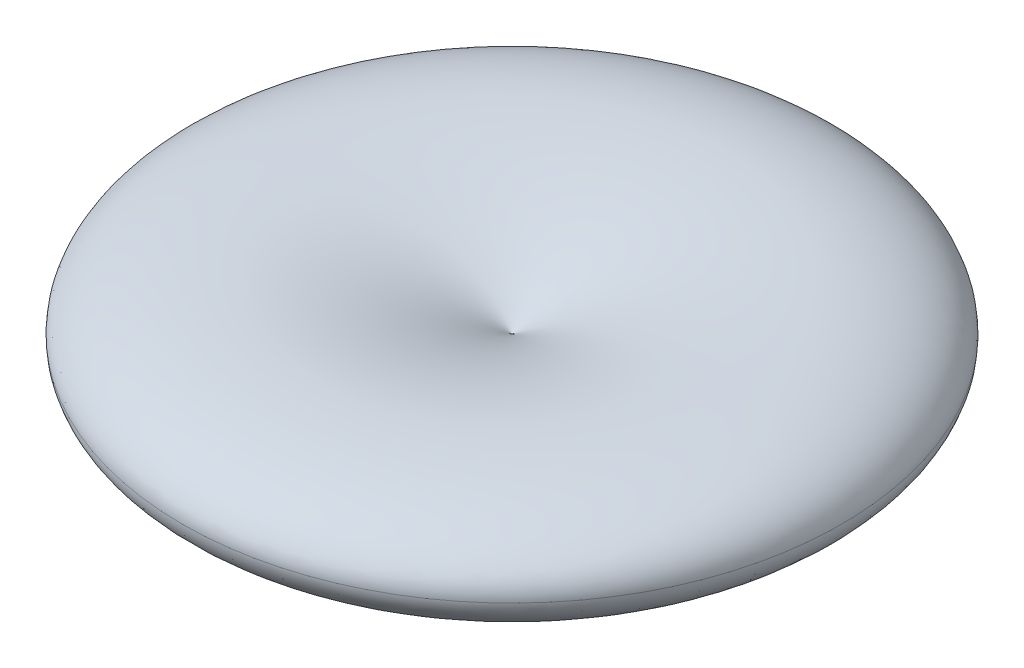
ISO-10303-21;
HEADER;
FILE_DESCRIPTION(('STEP AP214'),'2;1');
FILE_NAME('part.step','',(''),(''),'','','');
FILE_SCHEMA(('AUTOMOTIVE_DESIGN { 1 0 10303 214 1 1 1 1 }'));
ENDSEC;
DATA;
#1=APPLICATION_CONTEXT('core data for automotive mechanical design processes');
#2=APPLICATION_PROTOCOL_DEFINITION('international standard','automotive_design',2000,#1);
#3=PRODUCT_CONTEXT('',#1,'mechanical');
#4=PRODUCT('Part','Part','',(#3));
#5=PRODUCT_RELATED_PRODUCT_CATEGORY('part','',(#4));
#6=PRODUCT_DEFINITION_FORMATION('','',#4);
#7=PRODUCT_DEFINITION_CONTEXT('part definition',#1,'design');
#8=PRODUCT_DEFINITION('design','',#6,#7);
#9=PRODUCT_DEFINITION_SHAPE('','',#8);
#10=(LENGTH_UNIT() NAMED_UNIT(*) SI_UNIT(.MILLI.,.METRE.));
#11=(NAMED_UNIT(*) PLANE_ANGLE_UNIT() SI_UNIT($,.RADIAN.));
#12=(NAMED_UNIT(*) SI_UNIT($,.STERADIAN.) SOLID_ANGLE_UNIT());
#13=UNCERTAINTY_MEASURE_WITH_UNIT(LENGTH_MEASURE(1.E-05),#10,'distance_accuracy_value','');
#14=(GEOMETRIC_REPRESENTATION_CONTEXT(3) GLOBAL_UNCERTAINTY_ASSIGNED_CONTEXT((#13)) GLOBAL_UNIT_ASSIGNED_CONTEXT((#10,
#11,#12)) REPRESENTATION_CONTEXT('',''));
#15=CARTESIAN_POINT('',(0.,0.,0.));
#16=DIRECTION('',(0.,0.,1.));
#17=DIRECTION('',(1.,0.,0.));
#18=AXIS2_PLACEMENT_3D('',#15,#16,#17);
#19=CARTESIAN_POINT('',(99.4718394324346,-1.41039620800381E-10,0.));
#20=CARTESIAN_POINT('',(99.4718394324349,0.0144473478598722,0.));
#21=CARTESIAN_POINT('',(99.4715963263683,0.100376853939794,0.));
#22=CARTESIAN_POINT('',(99.4685044150183,0.260668693889387,0.));
#23=CARTESIAN_POINT('',(99.4533601096298,0.595682837165313,0.));
#24=CARTESIAN_POINT('',(99.41462537763,0.976418463843451,0.));
#25=CARTESIAN_POINT('',(99.3540461523916,1.36792825547944,0.));
#26=CARTESIAN_POINT('',(99.2534705677326,1.84681254939985,0.));
#27=CARTESIAN_POINT('',(99.1193903452542,2.34541049901015,0.));
#28=CARTESIAN_POINT('',(98.9206476731979,2.92374474966602,0.));
#29=CARTESIAN_POINT('',(98.6666319674632,3.50881884179896,0.));
#30=CARTESIAN_POINT('',(98.4016990429706,4.02461099086367,0.));
#31=CARTESIAN_POINT('',(98.0888839282801,4.56282402655693,0.));
#32=CARTESIAN_POINT('',(97.6951640008285,5.16212026891656,0.));
#33=CARTESIAN_POINT('',(97.1628176963727,5.86245289417468,0.));
#34=CARTESIAN_POINT('',(96.4373625251156,6.67731268259527,0.));
#35=CARTESIAN_POINT('',(95.5801255515856,7.50406015068173,0.));
#36=CARTESIAN_POINT('',(94.1898605246025,8.66771778819424,0.));
#37=CARTESIAN_POINT('',(92.1718544682701,10.0353728990684,0.));
#38=CARTESIAN_POINT('',(88.7774555219353,11.8371311972641,0.));
#39=CARTESIAN_POINT('',(83.7941691182405,13.6885492795961,0.));
#40=CARTESIAN_POINT('',(77.7625857397567,15.160935199828,0.));
#41=CARTESIAN_POINT('',(70.7294384458321,16.1308030471506,0.));
#42=CARTESIAN_POINT('',(63.5783466010685,16.5211973437359,0.));
#43=CARTESIAN_POINT('',(56.4188321795734,16.4110938369487,0.));
#44=CARTESIAN_POINT('',(49.2809304503626,15.8582302343043,0.));
#45=CARTESIAN_POINT('',(42.1864106461984,14.9008277002336,0.));
#46=CARTESIAN_POINT('',(35.1538909111103,13.5637629870977,0.));
#47=CARTESIAN_POINT('',(28.2009080374972,11.8610539754108,0.));
#48=CARTESIAN_POINT('',(21.346440136669,9.79684335553188,0.));
#49=CARTESIAN_POINT('',(15.4553760410452,7.66755148933256,0.));
#50=CARTESIAN_POINT('',(10.5026449447544,5.59592664226658,0.));
#51=CARTESIAN_POINT('',(6.62849030662822,3.7653929022448,0.));
#52=CARTESIAN_POINT('',(4.09896762801983,2.45476644253162,0.));
#53=CARTESIAN_POINT('',(2.24288406164808,1.40809591677828,0.));
#54=CARTESIAN_POINT('',(1.03451712583629,0.676317583030087,0.));
#55=CARTESIAN_POINT('',(0.438854819676063,0.296647328042432,0.));
#56=CARTESIAN_POINT('',(0.145358986213732,0.100261936553596,0.));
#57=CARTESIAN_POINT('',(0.,0.,0.));
#58=B_SPLINE_CURVE_WITH_KNOTS('',4,(#19,#20,#21,#22,#23,#24,#25,#26,#27,#28,#29,#30,#31,#32,#33,
#34,#35,#36,#37,#38,#39,#40,#41,#42,#43,#44,#45,#46,#47,#48,#49,#50,#51,#52,#53,#54,#55,#56,
#57),.UNSPECIFIED.,.F.,.F.,(5,1,1,1,1,1,1,1,1,1,1,1,1,1,1,1,1,1,1,1,1,1,1,1,1,1,1,1,1,1,1,1,1,1,
1,5),(0.,0.000530210460833125,0.00315120347170672,0.00577219648258021,0.0110141825043273,
0.0139325419690106,0.0168509014336941,0.0226876203630608,0.0288778054913386,0.0350679906196163,
0.0389048242343006,0.042741657848985,0.0504153250783538,0.0598661429218292,0.0693169607653048,
0.0804571481485323,0.09159733553176,0.122549245223811,0.15350103347294,0.213139912019091,
0.275043636222489,0.336947586705361,0.398851491376333,0.460755318045574,0.522659212220314,
0.584563072117397,0.646466896094265,0.708370874833197,0.770274852626706,0.83217861305455,
0.863130557962588,0.894082502870626,0.918524370822753,0.930745304798817,0.936855771786849,
0.942966238774881),.UNSPECIFIED.);
#59=CARTESIAN_POINT('',(-0.00647699333017381,-1000.04959738152,0.));
#60=DIRECTION('',(0.,-1.,0.));
#61=AXIS1_PLACEMENT('',#59,#60);
#62=SURFACE_OF_REVOLUTION('',#58,#61);
#63=CARTESIAN_POINT('',(-0.00647699333017381,0.,0.));
#64=DIRECTION('',(0.,-1.,0.));
#65=DIRECTION('',(0.,0.,-1.));
#66=AXIS2_PLACEMENT_3D('',#63,#64,#65);
#67=CIRCLE('',#66,0.00647699333017381);
#68=CARTESIAN_POINT('',(-0.00647699333017381,0.,-0.00647699333017381));
#69=VERTEX_POINT('',#68);
#70=EDGE_CURVE('E10',#69,#69,#67,.T.);
#71=ORIENTED_EDGE('',*,*,#70,.T.);
#72=EDGE_LOOP('',(#71));
#73=FACE_BOUND('',#72,.T.);
#74=CARTESIAN_POINT('',(-0.00647699333017381,-1.99840144432528E-12,0.));
#75=DIRECTION('',(0.,-1.,0.));
#76=DIRECTION('',(0.,0.,-1.));
#77=AXIS2_PLACEMENT_3D('',#74,#75,#76);
#78=CIRCLE('',#77,99.4783164257647);
#79=CARTESIAN_POINT('',(-0.00647699333017381,-1.99840144432528E-12,-99.4783164257647));
#80=VERTEX_POINT('',#79);
#81=EDGE_CURVE('E49',#80,#80,#78,.T.);
#82=ORIENTED_EDGE('',*,*,#81,.F.);
#83=EDGE_LOOP('',(#82));
#84=FACE_BOUND('',#83,.T.);
#85=ADVANCED_FACE('F41',(#73,#84),#62,.F.);
#86=CARTESIAN_POINT('',(0.,0.,0.));
#87=CARTESIAN_POINT('',(0.145790193622739,-0.100692877462947,0.));
#88=CARTESIAN_POINT('',(0.440407379928867,-0.297572779508345,0.));
#89=CARTESIAN_POINT('',(1.03805586437076,-0.678588563776049,0.));
#90=CARTESIAN_POINT('',(2.25066357804879,-1.41265533661017,0.));
#91=CARTESIAN_POINT('',(4.11259306865996,-2.46221760241834,0.));
#92=CARTESIAN_POINT('',(6.64973718207151,-3.77601640337769,0.));
#93=CARTESIAN_POINT('',(10.5349426129518,-5.61039561330158,0.));
#94=CARTESIAN_POINT('',(15.5012055007063,-7.68558056846305,0.));
#95=CARTESIAN_POINT('',(21.4084209799942,-9.81774728798721,0.));
#96=CARTESIAN_POINT('',(28.281738353775,-11.8834826549286,0.));
#97=CARTESIAN_POINT('',(35.2538280249267,-13.585869012048,0.));
#98=CARTESIAN_POINT('',(42.3056239703544,-14.920600217194,0.));
#99=CARTESIAN_POINT('',(49.4194217917738,-15.8733792349676,0.));
#100=CARTESIAN_POINT('',(56.5764762379778,-16.418944424255,0.));
#101=CARTESIAN_POINT('',(63.7546399679416,-16.5184104428506,0.));
#102=CARTESIAN_POINT('',(70.9235749423757,-16.1131035353008,0.));
#103=CARTESIAN_POINT('',(77.9370723723476,-15.1273829323976,0.));
#104=CARTESIAN_POINT('',(83.9454366027072,-13.6418615029591,0.));
#105=CARTESIAN_POINT('',(88.4804835597658,-11.9390769856124,0.));
#106=CARTESIAN_POINT('',(91.5857939123231,-10.3444370524486,0.));
#107=CARTESIAN_POINT('',(93.3773120308152,-9.21910907250545,0.));
#108=CARTESIAN_POINT('',(94.6211634499267,-8.31228349452792,0.));
#109=CARTESIAN_POINT('',(95.658146182042,-7.43334181135984,0.));
#110=CARTESIAN_POINT('',(96.5023724026683,-6.60916461083643,0.));
#111=CARTESIAN_POINT('',(97.2160582091683,-5.79701297751152,0.));
#112=CARTESIAN_POINT('',(97.8058956345197,-5.0110922904425,0.));
#113=CARTESIAN_POINT('',(98.281855630458,-4.25547197867446,0.));
#114=CARTESIAN_POINT('',(98.6547440507108,-3.54355480916215,0.));
#115=CARTESIAN_POINT('',(98.9478686536208,-2.8532090963375,0.));
#116=CARTESIAN_POINT('',(99.1685637859559,-2.19180981457102,0.));
#117=CARTESIAN_POINT('',(99.3092091347701,-1.6172287444906,0.));
#118=CARTESIAN_POINT('',(99.3857432668323,-1.17271722607694,0.));
#119=CARTESIAN_POINT('',(99.424795149428,-0.858561984038454,0.));
#120=CARTESIAN_POINT('',(99.4465784140517,-0.635651827631848,0.));
#121=CARTESIAN_POINT('',(99.462596123465,-0.408875718974352,0.));
#122=CARTESIAN_POINT('',(99.4698934755191,-0.211493591159207,0.));
#123=CARTESIAN_POINT('',(99.4718394324338,-0.0704622141827346,0.));
#124=CARTESIAN_POINT('',(99.4718394324346,-2.02615944890745E-12,0.));
#125=B_SPLINE_CURVE_WITH_KNOTS('',4,(#86,#87,#88,#89,#90,#91,#92,#93,#94,#95,#96,#97,#98,#99,
#100,#101,#102,#103,#104,#105,#106,#107,#108,#109,#110,#111,#112,#113,#114,#115,#116,#117,#118,
#119,#120,#121,#122,#123,#124),.UNSPECIFIED.,.F.,.F.,(5,1,1,1,1,1,1,1,1,1,1,1,1,1,1,1,1,1,1,1,1,
1,1,1,1,1,1,1,1,1,1,1,1,1,1,5),(0.0570337613374331,0.0631650237517542,0.0692962861660752,
0.0815588109947173,0.106083860652002,0.13711564024273,0.168147419833458,0.230210865849094,
0.292274534971075,0.354338207733876,0.416401853051635,0.478465509236148,0.540529113895668,
0.602592798876097,0.664656392874267,0.726720052311666,0.788783727269288,0.847344036582441,
0.878375788009596,0.893891818620489,0.909407849231382,0.920502522196195,0.931597195161008,
0.940898325253081,0.950199455345154,0.957882364425979,0.965565273506804,0.971771338025639,
0.977977402544474,0.983816845074475,0.989656287604475,0.992242215703356,0.993535179752797,
0.994828143802237,0.997414071901119,1.),.UNSPECIFIED.);
#126=CARTESIAN_POINT('',(-0.00647699333017381,-1000.04959738152,0.));
#127=DIRECTION('',(0.,-1.,0.));
#128=AXIS1_PLACEMENT('',#126,#127);
#129=SURFACE_OF_REVOLUTION('',#125,#128);
#130=ORIENTED_EDGE('',*,*,#81,.T.);
#131=EDGE_LOOP('',(#130));
#132=FACE_BOUND('',#131,.T.);
#133=ORIENTED_EDGE('',*,*,#70,.F.);
#134=EDGE_LOOP('',(#133));
#135=FACE_BOUND('',#134,.T.);
#136=ADVANCED_FACE('F66',(#132,#135),#129,.F.);
#137=CLOSED_SHELL('',(#85,#136));
#138=MANIFOLD_SOLID_BREP('B2',#137);
#139=ADVANCED_BREP_SHAPE_REPRESENTATION('',(#18,#138),#14);
#140=SHAPE_DEFINITION_REPRESENTATION(#9,#139);
ENDSEC;
END-ISO-10303-21;
